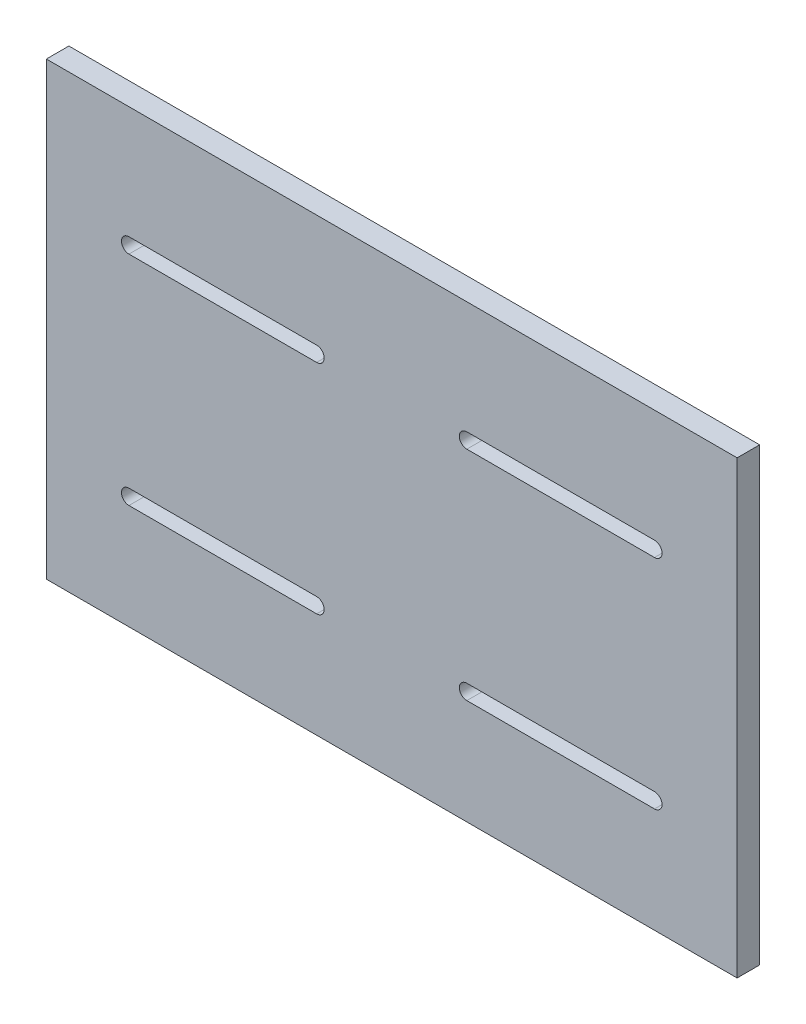
ISO-10303-21;
HEADER;
FILE_DESCRIPTION(('STEP AP214'),'2;1');
FILE_NAME('part.step','',(''),(''),'','','');
FILE_SCHEMA(('AUTOMOTIVE_DESIGN { 1 0 10303 214 1 1 1 1 }'));
ENDSEC;
DATA;
#1=APPLICATION_CONTEXT('core data for automotive mechanical design processes');
#2=APPLICATION_PROTOCOL_DEFINITION('international standard','automotive_design',2000,#1);
#3=PRODUCT_CONTEXT('',#1,'mechanical');
#4=PRODUCT('Part','Part','',(#3));
#5=PRODUCT_RELATED_PRODUCT_CATEGORY('part','',(#4));
#6=PRODUCT_DEFINITION_FORMATION('','',#4);
#7=PRODUCT_DEFINITION_CONTEXT('part definition',#1,'design');
#8=PRODUCT_DEFINITION('design','',#6,#7);
#9=PRODUCT_DEFINITION_SHAPE('','',#8);
#10=(LENGTH_UNIT() NAMED_UNIT(*) SI_UNIT(.MILLI.,.METRE.));
#11=(NAMED_UNIT(*) PLANE_ANGLE_UNIT() SI_UNIT($,.RADIAN.));
#12=(NAMED_UNIT(*) SI_UNIT($,.STERADIAN.) SOLID_ANGLE_UNIT());
#13=UNCERTAINTY_MEASURE_WITH_UNIT(LENGTH_MEASURE(1.E-05),#10,'distance_accuracy_value','');
#14=(GEOMETRIC_REPRESENTATION_CONTEXT(3) GLOBAL_UNCERTAINTY_ASSIGNED_CONTEXT((#13)) GLOBAL_UNIT_ASSIGNED_CONTEXT((#10,
#11,#12)) REPRESENTATION_CONTEXT('',''));
#15=CARTESIAN_POINT('',(0.,0.,0.));
#16=DIRECTION('',(0.,0.,1.));
#17=DIRECTION('',(1.,0.,0.));
#18=AXIS2_PLACEMENT_3D('',#15,#16,#17);
#19=CARTESIAN_POINT('',(46.,30.,3.));
#20=DIRECTION('',(-1.,0.,0.));
#21=DIRECTION('',(0.,-1.,0.));
#22=AXIS2_PLACEMENT_3D('',#19,#20,#21);
#23=PLANE('',#22);
#24=DIRECTION('',(0.,1.,0.));
#25=VECTOR('',#24,1.);
#26=CARTESIAN_POINT('',(46.,30.,0.));
#27=LINE('',#26,#25);
#28=CARTESIAN_POINT('',(46.,-30.,0.));
#29=VERTEX_POINT('',#28);
#30=CARTESIAN_POINT('',(46.,30.,0.));
#31=VERTEX_POINT('',#30);
#32=EDGE_CURVE('E296',#29,#31,#27,.T.);
#33=ORIENTED_EDGE('',*,*,#32,.T.);
#34=DIRECTION('',(0.,0.,-1.));
#35=VECTOR('',#34,1.);
#36=CARTESIAN_POINT('',(46.,30.,3.));
#37=LINE('',#36,#35);
#38=CARTESIAN_POINT('',(46.,30.,3.));
#39=VERTEX_POINT('',#38);
#40=EDGE_CURVE('E11',#39,#31,#37,.T.);
#41=ORIENTED_EDGE('',*,*,#40,.F.);
#42=DIRECTION('',(0.,1.,0.));
#43=VECTOR('',#42,1.);
#44=CARTESIAN_POINT('',(46.,30.,3.));
#45=LINE('',#44,#43);
#46=CARTESIAN_POINT('',(46.,-30.,3.));
#47=VERTEX_POINT('',#46);
#48=EDGE_CURVE('E303',#47,#39,#45,.T.);
#49=ORIENTED_EDGE('',*,*,#48,.F.);
#50=DIRECTION('',(0.,0.,-1.));
#51=VECTOR('',#50,1.);
#52=CARTESIAN_POINT('',(46.,-30.,3.));
#53=LINE('',#52,#51);
#54=EDGE_CURVE('E313',#47,#29,#53,.T.);
#55=ORIENTED_EDGE('',*,*,#54,.T.);
#56=EDGE_LOOP('',(#33,#41,#49,#55));
#57=FACE_BOUND('',#56,.T.);
#58=ADVANCED_FACE('F33',(#57),#23,.F.);
#59=CARTESIAN_POINT('',(-46.,30.,3.));
#60=DIRECTION('',(0.,-1.,0.));
#61=DIRECTION('',(0.,0.,-1.));
#62=AXIS2_PLACEMENT_3D('',#59,#60,#61);
#63=PLANE('',#62);
#64=DIRECTION('',(-1.,0.,0.));
#65=VECTOR('',#64,1.);
#66=CARTESIAN_POINT('',(-46.,30.,0.));
#67=LINE('',#66,#65);
#68=CARTESIAN_POINT('',(-46.,30.,0.));
#69=VERTEX_POINT('',#68);
#70=EDGE_CURVE('E316',#31,#69,#67,.T.);
#71=ORIENTED_EDGE('',*,*,#70,.T.);
#72=DIRECTION('',(0.,0.,-1.));
#73=VECTOR('',#72,1.);
#74=CARTESIAN_POINT('',(-46.,30.,3.));
#75=LINE('',#74,#73);
#76=CARTESIAN_POINT('',(-46.,30.,3.));
#77=VERTEX_POINT('',#76);
#78=EDGE_CURVE('E40',#77,#69,#75,.T.);
#79=ORIENTED_EDGE('',*,*,#78,.F.);
#80=DIRECTION('',(-1.,0.,0.));
#81=VECTOR('',#80,1.);
#82=CARTESIAN_POINT('',(-46.,30.,3.));
#83=LINE('',#82,#81);
#84=EDGE_CURVE('E306',#39,#77,#83,.T.);
#85=ORIENTED_EDGE('',*,*,#84,.F.);
#86=ORIENTED_EDGE('',*,*,#40,.T.);
#87=EDGE_LOOP('',(#71,#79,#85,#86));
#88=FACE_BOUND('',#87,.T.);
#89=ADVANCED_FACE('F345',(#88),#63,.F.);
#90=CARTESIAN_POINT('',(-46.,30.,3.));
#91=DIRECTION('',(1.,0.,0.));
#92=DIRECTION('',(0.,1.,0.));
#93=AXIS2_PLACEMENT_3D('',#90,#91,#92);
#94=PLANE('',#93);
#95=DIRECTION('',(0.,-1.,0.));
#96=VECTOR('',#95,1.);
#97=CARTESIAN_POINT('',(-46.,30.,0.));
#98=LINE('',#97,#96);
#99=CARTESIAN_POINT('',(-46.,-30.,0.));
#100=VERTEX_POINT('',#99);
#101=EDGE_CURVE('E318',#69,#100,#98,.T.);
#102=ORIENTED_EDGE('',*,*,#101,.T.);
#103=DIRECTION('',(0.,0.,-1.));
#104=VECTOR('',#103,1.);
#105=CARTESIAN_POINT('',(-46.,-30.,3.));
#106=LINE('',#105,#104);
#107=CARTESIAN_POINT('',(-46.,-30.,3.));
#108=VERTEX_POINT('',#107);
#109=EDGE_CURVE('E323',#108,#100,#106,.T.);
#110=ORIENTED_EDGE('',*,*,#109,.F.);
#111=DIRECTION('',(0.,-1.,0.));
#112=VECTOR('',#111,1.);
#113=CARTESIAN_POINT('',(-46.,30.,3.));
#114=LINE('',#113,#112);
#115=EDGE_CURVE('E309',#77,#108,#114,.T.);
#116=ORIENTED_EDGE('',*,*,#115,.F.);
#117=ORIENTED_EDGE('',*,*,#78,.T.);
#118=EDGE_LOOP('',(#102,#110,#116,#117));
#119=FACE_BOUND('',#118,.T.);
#120=ADVANCED_FACE('F330',(#119),#94,.F.);
#121=CARTESIAN_POINT('',(-46.,-30.,3.));
#122=DIRECTION('',(0.,1.,0.));
#123=DIRECTION('',(0.,0.,1.));
#124=AXIS2_PLACEMENT_3D('',#121,#122,#123);
#125=PLANE('',#124);
#126=DIRECTION('',(1.,0.,0.));
#127=VECTOR('',#126,1.);
#128=CARTESIAN_POINT('',(-46.,-30.,0.));
#129=LINE('',#128,#127);
#130=EDGE_CURVE('E307',#100,#29,#129,.T.);
#131=ORIENTED_EDGE('',*,*,#130,.T.);
#132=ORIENTED_EDGE('',*,*,#54,.F.);
#133=DIRECTION('',(1.,0.,0.));
#134=VECTOR('',#133,1.);
#135=CARTESIAN_POINT('',(-46.,-30.,3.));
#136=LINE('',#135,#134);
#137=EDGE_CURVE('E311',#108,#47,#136,.T.);
#138=ORIENTED_EDGE('',*,*,#137,.F.);
#139=ORIENTED_EDGE('',*,*,#109,.T.);
#140=EDGE_LOOP('',(#131,#132,#138,#139));
#141=FACE_BOUND('',#140,.T.);
#142=ADVANCED_FACE('F338',(#141),#125,.F.);
#143=CARTESIAN_POINT('',(0.,0.,3.));
#144=DIRECTION('',(0.,0.,1.));
#145=DIRECTION('',(1.,0.,0.));
#146=AXIS2_PLACEMENT_3D('',#143,#144,#145);
#147=PLANE('',#146);
#148=CARTESIAN_POINT('',(-35.,-15.,3.));
#149=DIRECTION('',(0.,0.,1.));
#150=DIRECTION('',(1.,0.,0.));
#151=AXIS2_PLACEMENT_3D('',#148,#149,#150);
#152=CIRCLE('',#151,1.00000000000001);
#153=CARTESIAN_POINT('',(-35.,-14.,3.));
#154=VERTEX_POINT('',#153);
#155=CARTESIAN_POINT('',(-35.,-16.,3.));
#156=VERTEX_POINT('',#155);
#157=EDGE_CURVE('E47',#154,#156,#152,.T.);
#158=ORIENTED_EDGE('',*,*,#157,.F.);
#159=DIRECTION('',(-1.,0.,0.));
#160=VECTOR('',#159,1.);
#161=CARTESIAN_POINT('',(-35.,-14.,3.));
#162=LINE('',#161,#160);
#163=CARTESIAN_POINT('',(-9.99999999999999,-14.,3.));
#164=VERTEX_POINT('',#163);
#165=EDGE_CURVE('E190',#164,#154,#162,.T.);
#166=ORIENTED_EDGE('',*,*,#165,.F.);
#167=CARTESIAN_POINT('',(-9.99999999999999,-15.,3.));
#168=DIRECTION('',(0.,0.,1.));
#169=DIRECTION('',(1.,0.,0.));
#170=AXIS2_PLACEMENT_3D('',#167,#168,#169);
#171=CIRCLE('',#170,1.00000000000001);
#172=CARTESIAN_POINT('',(-9.99999999999999,-16.,3.));
#173=VERTEX_POINT('',#172);
#174=EDGE_CURVE('E193',#173,#164,#171,.T.);
#175=ORIENTED_EDGE('',*,*,#174,.F.);
#176=DIRECTION('',(1.,0.,0.));
#177=VECTOR('',#176,1.);
#178=CARTESIAN_POINT('',(-35.,-16.,3.));
#179=LINE('',#178,#177);
#180=EDGE_CURVE('E199',#156,#173,#179,.T.);
#181=ORIENTED_EDGE('',*,*,#180,.F.);
#182=EDGE_LOOP('',(#158,#166,#175,#181));
#183=FACE_BOUND('',#182,.T.);
#184=CARTESIAN_POINT('',(35.,14.,3.));
#185=DIRECTION('',(0.,0.,1.));
#186=DIRECTION('',(1.,0.,0.));
#187=AXIS2_PLACEMENT_3D('',#184,#185,#186);
#188=CIRCLE('',#187,0.999999999999999);
#189=CARTESIAN_POINT('',(35.,13.,3.));
#190=VERTEX_POINT('',#189);
#191=CARTESIAN_POINT('',(35.,15.,3.));
#192=VERTEX_POINT('',#191);
#193=EDGE_CURVE('E55',#190,#192,#188,.T.);
#194=ORIENTED_EDGE('',*,*,#193,.F.);
#195=DIRECTION('',(1.,0.,0.));
#196=VECTOR('',#195,1.);
#197=CARTESIAN_POINT('',(35.,13.,3.));
#198=LINE('',#197,#196);
#199=CARTESIAN_POINT('',(10.,13.,3.));
#200=VERTEX_POINT('',#199);
#201=EDGE_CURVE('E214',#200,#190,#198,.T.);
#202=ORIENTED_EDGE('',*,*,#201,.F.);
#203=CARTESIAN_POINT('',(10.,14.,3.));
#204=DIRECTION('',(0.,0.,1.));
#205=DIRECTION('',(1.,0.,0.));
#206=AXIS2_PLACEMENT_3D('',#203,#204,#205);
#207=CIRCLE('',#206,0.999999999999999);
#208=CARTESIAN_POINT('',(10.,15.,3.));
#209=VERTEX_POINT('',#208);
#210=EDGE_CURVE('E229',#209,#200,#207,.T.);
#211=ORIENTED_EDGE('',*,*,#210,.F.);
#212=DIRECTION('',(-1.,0.,0.));
#213=VECTOR('',#212,1.);
#214=CARTESIAN_POINT('',(35.,15.,3.));
#215=LINE('',#214,#213);
#216=EDGE_CURVE('E225',#192,#209,#215,.T.);
#217=ORIENTED_EDGE('',*,*,#216,.F.);
#218=EDGE_LOOP('',(#194,#202,#211,#217));
#219=FACE_BOUND('',#218,.T.);
#220=CARTESIAN_POINT('',(35.,-15.,3.));
#221=DIRECTION('',(0.,0.,1.));
#222=DIRECTION('',(1.,0.,0.));
#223=AXIS2_PLACEMENT_3D('',#220,#221,#222);
#224=CIRCLE('',#223,1.);
#225=CARTESIAN_POINT('',(35.,-16.,3.));
#226=VERTEX_POINT('',#225);
#227=CARTESIAN_POINT('',(35.,-14.,3.));
#228=VERTEX_POINT('',#227);
#229=EDGE_CURVE('E254',#226,#228,#224,.T.);
#230=ORIENTED_EDGE('',*,*,#229,.F.);
#231=DIRECTION('',(1.,0.,0.));
#232=VECTOR('',#231,1.);
#233=CARTESIAN_POINT('',(35.,-16.,3.));
#234=LINE('',#233,#232);
#235=CARTESIAN_POINT('',(10.,-16.,3.));
#236=VERTEX_POINT('',#235);
#237=EDGE_CURVE('E244',#236,#226,#234,.T.);
#238=ORIENTED_EDGE('',*,*,#237,.F.);
#239=CARTESIAN_POINT('',(10.,-15.,3.));
#240=DIRECTION('',(0.,0.,1.));
#241=DIRECTION('',(1.,0.,0.));
#242=AXIS2_PLACEMENT_3D('',#239,#240,#241);
#243=CIRCLE('',#242,1.);
#244=CARTESIAN_POINT('',(10.,-14.,3.));
#245=VERTEX_POINT('',#244);
#246=EDGE_CURVE('E259',#245,#236,#243,.T.);
#247=ORIENTED_EDGE('',*,*,#246,.F.);
#248=DIRECTION('',(-1.,0.,0.));
#249=VECTOR('',#248,1.);
#250=CARTESIAN_POINT('',(35.,-14.,3.));
#251=LINE('',#250,#249);
#252=EDGE_CURVE('E256',#228,#245,#251,.T.);
#253=ORIENTED_EDGE('',*,*,#252,.F.);
#254=EDGE_LOOP('',(#230,#238,#247,#253));
#255=FACE_BOUND('',#254,.T.);
#256=CARTESIAN_POINT('',(-35.,14.,3.));
#257=DIRECTION('',(0.,0.,1.));
#258=DIRECTION('',(1.,0.,0.));
#259=AXIS2_PLACEMENT_3D('',#256,#257,#258);
#260=CIRCLE('',#259,1.);
#261=CARTESIAN_POINT('',(-35.,15.,3.));
#262=VERTEX_POINT('',#261);
#263=CARTESIAN_POINT('',(-35.,13.,3.));
#264=VERTEX_POINT('',#263);
#265=EDGE_CURVE('E206',#262,#264,#260,.T.);
#266=ORIENTED_EDGE('',*,*,#265,.F.);
#267=DIRECTION('',(-1.,0.,0.));
#268=VECTOR('',#267,1.);
#269=CARTESIAN_POINT('',(-35.,15.,3.));
#270=LINE('',#269,#268);
#271=CARTESIAN_POINT('',(-10.,15.,3.));
#272=VERTEX_POINT('',#271);
#273=EDGE_CURVE('E275',#272,#262,#270,.T.);
#274=ORIENTED_EDGE('',*,*,#273,.F.);
#275=CARTESIAN_POINT('',(-10.,14.,3.));
#276=DIRECTION('',(0.,0.,1.));
#277=DIRECTION('',(1.,0.,0.));
#278=AXIS2_PLACEMENT_3D('',#275,#276,#277);
#279=CIRCLE('',#278,1.);
#280=CARTESIAN_POINT('',(-10.,13.,3.));
#281=VERTEX_POINT('',#280);
#282=EDGE_CURVE('E289',#281,#272,#279,.T.);
#283=ORIENTED_EDGE('',*,*,#282,.F.);
#284=DIRECTION('',(1.,0.,0.));
#285=VECTOR('',#284,1.);
#286=CARTESIAN_POINT('',(-35.,13.,3.));
#287=LINE('',#286,#285);
#288=EDGE_CURVE('E286',#264,#281,#287,.T.);
#289=ORIENTED_EDGE('',*,*,#288,.F.);
#290=EDGE_LOOP('',(#266,#274,#283,#289));
#291=FACE_BOUND('',#290,.T.);
#292=ORIENTED_EDGE('',*,*,#48,.T.);
#293=ORIENTED_EDGE('',*,*,#84,.T.);
#294=ORIENTED_EDGE('',*,*,#115,.T.);
#295=ORIENTED_EDGE('',*,*,#137,.T.);
#296=EDGE_LOOP('',(#292,#293,#294,#295));
#297=FACE_BOUND('',#296,.T.);
#298=ADVANCED_FACE('F344',(#183,#219,#255,#291,#297),#147,.T.);
#299=CARTESIAN_POINT('',(0.,0.,0.));
#300=DIRECTION('',(0.,0.,1.));
#301=DIRECTION('',(1.,0.,0.));
#302=AXIS2_PLACEMENT_3D('',#299,#300,#301);
#303=PLANE('',#302);
#304=DIRECTION('',(-1.,0.,0.));
#305=VECTOR('',#304,1.);
#306=CARTESIAN_POINT('',(-35.,-14.,0.));
#307=LINE('',#306,#305);
#308=CARTESIAN_POINT('',(-9.99999999999999,-14.,0.));
#309=VERTEX_POINT('',#308);
#310=CARTESIAN_POINT('',(-35.,-14.,0.));
#311=VERTEX_POINT('',#310);
#312=EDGE_CURVE('E177',#309,#311,#307,.T.);
#313=ORIENTED_EDGE('',*,*,#312,.T.);
#314=CARTESIAN_POINT('',(-35.,-15.,0.));
#315=DIRECTION('',(0.,0.,1.));
#316=DIRECTION('',(1.,0.,0.));
#317=AXIS2_PLACEMENT_3D('',#314,#315,#316);
#318=CIRCLE('',#317,1.00000000000001);
#319=CARTESIAN_POINT('',(-35.,-16.,0.));
#320=VERTEX_POINT('',#319);
#321=EDGE_CURVE('E171',#311,#320,#318,.T.);
#322=ORIENTED_EDGE('',*,*,#321,.T.);
#323=DIRECTION('',(1.,0.,0.));
#324=VECTOR('',#323,1.);
#325=CARTESIAN_POINT('',(-35.,-16.,0.));
#326=LINE('',#325,#324);
#327=CARTESIAN_POINT('',(-9.99999999999999,-16.,0.));
#328=VERTEX_POINT('',#327);
#329=EDGE_CURVE('E181',#320,#328,#326,.T.);
#330=ORIENTED_EDGE('',*,*,#329,.T.);
#331=CARTESIAN_POINT('',(-9.99999999999999,-15.,0.));
#332=DIRECTION('',(0.,0.,1.));
#333=DIRECTION('',(1.,0.,0.));
#334=AXIS2_PLACEMENT_3D('',#331,#332,#333);
#335=CIRCLE('',#334,1.00000000000001);
#336=EDGE_CURVE('E185',#328,#309,#335,.T.);
#337=ORIENTED_EDGE('',*,*,#336,.T.);
#338=EDGE_LOOP('',(#313,#322,#330,#337));
#339=FACE_BOUND('',#338,.T.);
#340=DIRECTION('',(1.,0.,0.));
#341=VECTOR('',#340,1.);
#342=CARTESIAN_POINT('',(35.,13.,0.));
#343=LINE('',#342,#341);
#344=CARTESIAN_POINT('',(10.,13.,0.));
#345=VERTEX_POINT('',#344);
#346=CARTESIAN_POINT('',(35.,13.,0.));
#347=VERTEX_POINT('',#346);
#348=EDGE_CURVE('E220',#345,#347,#343,.T.);
#349=ORIENTED_EDGE('',*,*,#348,.T.);
#350=CARTESIAN_POINT('',(35.,14.,0.));
#351=DIRECTION('',(0.,0.,1.));
#352=DIRECTION('',(1.,0.,0.));
#353=AXIS2_PLACEMENT_3D('',#350,#351,#352);
#354=CIRCLE('',#353,0.999999999999999);
#355=CARTESIAN_POINT('',(35.,15.,0.));
#356=VERTEX_POINT('',#355);
#357=EDGE_CURVE('E210',#347,#356,#354,.T.);
#358=ORIENTED_EDGE('',*,*,#357,.T.);
#359=DIRECTION('',(-1.,0.,0.));
#360=VECTOR('',#359,1.);
#361=CARTESIAN_POINT('',(35.,15.,0.));
#362=LINE('',#361,#360);
#363=CARTESIAN_POINT('',(10.,15.,0.));
#364=VERTEX_POINT('',#363);
#365=EDGE_CURVE('E213',#356,#364,#362,.T.);
#366=ORIENTED_EDGE('',*,*,#365,.T.);
#367=CARTESIAN_POINT('',(10.,14.,0.));
#368=DIRECTION('',(0.,0.,1.));
#369=DIRECTION('',(1.,0.,0.));
#370=AXIS2_PLACEMENT_3D('',#367,#368,#369);
#371=CIRCLE('',#370,0.999999999999999);
#372=EDGE_CURVE('E217',#364,#345,#371,.T.);
#373=ORIENTED_EDGE('',*,*,#372,.T.);
#374=EDGE_LOOP('',(#349,#358,#366,#373));
#375=FACE_BOUND('',#374,.T.);
#376=DIRECTION('',(1.,0.,0.));
#377=VECTOR('',#376,1.);
#378=CARTESIAN_POINT('',(35.,-16.,0.));
#379=LINE('',#378,#377);
#380=CARTESIAN_POINT('',(10.,-16.,0.));
#381=VERTEX_POINT('',#380);
#382=CARTESIAN_POINT('',(35.,-16.,0.));
#383=VERTEX_POINT('',#382);
#384=EDGE_CURVE('E250',#381,#383,#379,.T.);
#385=ORIENTED_EDGE('',*,*,#384,.T.);
#386=CARTESIAN_POINT('',(35.,-15.,0.));
#387=DIRECTION('',(0.,0.,1.));
#388=DIRECTION('',(1.,0.,0.));
#389=AXIS2_PLACEMENT_3D('',#386,#387,#388);
#390=CIRCLE('',#389,1.);
#391=CARTESIAN_POINT('',(35.,-14.,0.));
#392=VERTEX_POINT('',#391);
#393=EDGE_CURVE('E240',#383,#392,#390,.T.);
#394=ORIENTED_EDGE('',*,*,#393,.T.);
#395=DIRECTION('',(-1.,0.,0.));
#396=VECTOR('',#395,1.);
#397=CARTESIAN_POINT('',(35.,-14.,0.));
#398=LINE('',#397,#396);
#399=CARTESIAN_POINT('',(10.,-14.,0.));
#400=VERTEX_POINT('',#399);
#401=EDGE_CURVE('E243',#392,#400,#398,.T.);
#402=ORIENTED_EDGE('',*,*,#401,.T.);
#403=CARTESIAN_POINT('',(10.,-15.,0.));
#404=DIRECTION('',(0.,0.,1.));
#405=DIRECTION('',(1.,0.,0.));
#406=AXIS2_PLACEMENT_3D('',#403,#404,#405);
#407=CIRCLE('',#406,1.);
#408=EDGE_CURVE('E247',#400,#381,#407,.T.);
#409=ORIENTED_EDGE('',*,*,#408,.T.);
#410=EDGE_LOOP('',(#385,#394,#402,#409));
#411=FACE_BOUND('',#410,.T.);
#412=DIRECTION('',(-1.,0.,0.));
#413=VECTOR('',#412,1.);
#414=CARTESIAN_POINT('',(-35.,15.,0.));
#415=LINE('',#414,#413);
#416=CARTESIAN_POINT('',(-10.,15.,0.));
#417=VERTEX_POINT('',#416);
#418=CARTESIAN_POINT('',(-35.,15.,0.));
#419=VERTEX_POINT('',#418);
#420=EDGE_CURVE('E281',#417,#419,#415,.T.);
#421=ORIENTED_EDGE('',*,*,#420,.T.);
#422=CARTESIAN_POINT('',(-35.,14.,0.));
#423=DIRECTION('',(0.,0.,1.));
#424=DIRECTION('',(1.,0.,0.));
#425=AXIS2_PLACEMENT_3D('',#422,#423,#424);
#426=CIRCLE('',#425,1.);
#427=CARTESIAN_POINT('',(-35.,13.,0.));
#428=VERTEX_POINT('',#427);
#429=EDGE_CURVE('E271',#419,#428,#426,.T.);
#430=ORIENTED_EDGE('',*,*,#429,.T.);
#431=DIRECTION('',(1.,0.,0.));
#432=VECTOR('',#431,1.);
#433=CARTESIAN_POINT('',(-35.,13.,0.));
#434=LINE('',#433,#432);
#435=CARTESIAN_POINT('',(-10.,13.,0.));
#436=VERTEX_POINT('',#435);
#437=EDGE_CURVE('E274',#428,#436,#434,.T.);
#438=ORIENTED_EDGE('',*,*,#437,.T.);
#439=CARTESIAN_POINT('',(-10.,14.,0.));
#440=DIRECTION('',(0.,0.,1.));
#441=DIRECTION('',(1.,0.,0.));
#442=AXIS2_PLACEMENT_3D('',#439,#440,#441);
#443=CIRCLE('',#442,1.);
#444=EDGE_CURVE('E278',#436,#417,#443,.T.);
#445=ORIENTED_EDGE('',*,*,#444,.T.);
#446=EDGE_LOOP('',(#421,#430,#438,#445));
#447=FACE_BOUND('',#446,.T.);
#448=ORIENTED_EDGE('',*,*,#32,.F.);
#449=ORIENTED_EDGE('',*,*,#130,.F.);
#450=ORIENTED_EDGE('',*,*,#101,.F.);
#451=ORIENTED_EDGE('',*,*,#70,.F.);
#452=EDGE_LOOP('',(#448,#449,#450,#451));
#453=FACE_BOUND('',#452,.T.);
#454=ADVANCED_FACE('F187',(#339,#375,#411,#447,#453),#303,.F.);
#455=CARTESIAN_POINT('',(-35.,14.,0.));
#456=DIRECTION('',(0.,0.,1.));
#457=DIRECTION('',(1.,0.,0.));
#458=AXIS2_PLACEMENT_3D('',#455,#456,#457);
#459=CYLINDRICAL_SURFACE('',#458,1.);
#460=ORIENTED_EDGE('',*,*,#265,.T.);
#461=DIRECTION('',(0.,0.,1.));
#462=VECTOR('',#461,1.);
#463=CARTESIAN_POINT('',(-35.,13.,0.));
#464=LINE('',#463,#462);
#465=EDGE_CURVE('E284',#428,#264,#464,.T.);
#466=ORIENTED_EDGE('',*,*,#465,.F.);
#467=ORIENTED_EDGE('',*,*,#429,.F.);
#468=DIRECTION('',(0.,0.,1.));
#469=VECTOR('',#468,1.);
#470=CARTESIAN_POINT('',(-35.,15.,0.));
#471=LINE('',#470,#469);
#472=EDGE_CURVE('E294',#419,#262,#471,.T.);
#473=ORIENTED_EDGE('',*,*,#472,.T.);
#474=EDGE_LOOP('',(#460,#466,#467,#473));
#475=FACE_BOUND('',#474,.T.);
#476=ADVANCED_FACE('F357',(#475),#459,.F.);
#477=CARTESIAN_POINT('',(-35.,15.,0.));
#478=DIRECTION('',(0.,1.,0.));
#479=DIRECTION('',(0.,0.,1.));
#480=AXIS2_PLACEMENT_3D('',#477,#478,#479);
#481=PLANE('',#480);
#482=ORIENTED_EDGE('',*,*,#273,.T.);
#483=ORIENTED_EDGE('',*,*,#472,.F.);
#484=ORIENTED_EDGE('',*,*,#420,.F.);
#485=DIRECTION('',(0.,0.,1.));
#486=VECTOR('',#485,1.);
#487=CARTESIAN_POINT('',(-10.,15.,0.));
#488=LINE('',#487,#486);
#489=EDGE_CURVE('E297',#417,#272,#488,.T.);
#490=ORIENTED_EDGE('',*,*,#489,.T.);
#491=EDGE_LOOP('',(#482,#483,#484,#490));
#492=FACE_BOUND('',#491,.T.);
#493=ADVANCED_FACE('F363',(#492),#481,.F.);
#494=CARTESIAN_POINT('',(-10.,14.,0.));
#495=DIRECTION('',(0.,0.,1.));
#496=DIRECTION('',(1.,0.,0.));
#497=AXIS2_PLACEMENT_3D('',#494,#495,#496);
#498=CYLINDRICAL_SURFACE('',#497,1.);
#499=ORIENTED_EDGE('',*,*,#282,.T.);
#500=ORIENTED_EDGE('',*,*,#489,.F.);
#501=ORIENTED_EDGE('',*,*,#444,.F.);
#502=DIRECTION('',(0.,0.,1.));
#503=VECTOR('',#502,1.);
#504=CARTESIAN_POINT('',(-10.,13.,0.));
#505=LINE('',#504,#503);
#506=EDGE_CURVE('E299',#436,#281,#505,.T.);
#507=ORIENTED_EDGE('',*,*,#506,.T.);
#508=EDGE_LOOP('',(#499,#500,#501,#507));
#509=FACE_BOUND('',#508,.T.);
#510=ADVANCED_FACE('F369',(#509),#498,.F.);
#511=CARTESIAN_POINT('',(-35.,13.,0.));
#512=DIRECTION('',(0.,-1.,0.));
#513=DIRECTION('',(0.,0.,-1.));
#514=AXIS2_PLACEMENT_3D('',#511,#512,#513);
#515=PLANE('',#514);
#516=ORIENTED_EDGE('',*,*,#288,.T.);
#517=ORIENTED_EDGE('',*,*,#506,.F.);
#518=ORIENTED_EDGE('',*,*,#437,.F.);
#519=ORIENTED_EDGE('',*,*,#465,.T.);
#520=EDGE_LOOP('',(#516,#517,#518,#519));
#521=FACE_BOUND('',#520,.T.);
#522=ADVANCED_FACE('F365',(#521),#515,.F.);
#523=CARTESIAN_POINT('',(35.,-15.,0.));
#524=DIRECTION('',(0.,0.,1.));
#525=DIRECTION('',(1.,0.,0.));
#526=AXIS2_PLACEMENT_3D('',#523,#524,#525);
#527=CYLINDRICAL_SURFACE('',#526,1.);
#528=ORIENTED_EDGE('',*,*,#229,.T.);
#529=DIRECTION('',(0.,0.,1.));
#530=VECTOR('',#529,1.);
#531=CARTESIAN_POINT('',(35.,-14.,0.));
#532=LINE('',#531,#530);
#533=EDGE_CURVE('E253',#392,#228,#532,.T.);
#534=ORIENTED_EDGE('',*,*,#533,.F.);
#535=ORIENTED_EDGE('',*,*,#393,.F.);
#536=DIRECTION('',(0.,0.,1.));
#537=VECTOR('',#536,1.);
#538=CARTESIAN_POINT('',(35.,-16.,0.));
#539=LINE('',#538,#537);
#540=EDGE_CURVE('E226',#383,#226,#539,.T.);
#541=ORIENTED_EDGE('',*,*,#540,.T.);
#542=EDGE_LOOP('',(#528,#534,#535,#541));
#543=FACE_BOUND('',#542,.T.);
#544=ADVANCED_FACE('F368',(#543),#527,.F.);
#545=CARTESIAN_POINT('',(35.,-16.,0.));
#546=DIRECTION('',(0.,-1.,0.));
#547=DIRECTION('',(0.,0.,-1.));
#548=AXIS2_PLACEMENT_3D('',#545,#546,#547);
#549=PLANE('',#548);
#550=ORIENTED_EDGE('',*,*,#237,.T.);
#551=ORIENTED_EDGE('',*,*,#540,.F.);
#552=ORIENTED_EDGE('',*,*,#384,.F.);
#553=DIRECTION('',(0.,0.,1.));
#554=VECTOR('',#553,1.);
#555=CARTESIAN_POINT('',(10.,-16.,0.));
#556=LINE('',#555,#554);
#557=EDGE_CURVE('E265',#381,#236,#556,.T.);
#558=ORIENTED_EDGE('',*,*,#557,.T.);
#559=EDGE_LOOP('',(#550,#551,#552,#558));
#560=FACE_BOUND('',#559,.T.);
#561=ADVANCED_FACE('F379',(#560),#549,.F.);
#562=CARTESIAN_POINT('',(10.,-15.,0.));
#563=DIRECTION('',(0.,0.,1.));
#564=DIRECTION('',(1.,0.,0.));
#565=AXIS2_PLACEMENT_3D('',#562,#563,#564);
#566=CYLINDRICAL_SURFACE('',#565,1.);
#567=ORIENTED_EDGE('',*,*,#246,.T.);
#568=ORIENTED_EDGE('',*,*,#557,.F.);
#569=ORIENTED_EDGE('',*,*,#408,.F.);
#570=DIRECTION('',(0.,0.,1.));
#571=VECTOR('',#570,1.);
#572=CARTESIAN_POINT('',(10.,-14.,0.));
#573=LINE('',#572,#571);
#574=EDGE_CURVE('E267',#400,#245,#573,.T.);
#575=ORIENTED_EDGE('',*,*,#574,.T.);
#576=EDGE_LOOP('',(#567,#568,#569,#575));
#577=FACE_BOUND('',#576,.T.);
#578=ADVANCED_FACE('F385',(#577),#566,.F.);
#579=CARTESIAN_POINT('',(35.,-14.,0.));
#580=DIRECTION('',(0.,1.,0.));
#581=DIRECTION('',(-1.,0.,0.));
#582=AXIS2_PLACEMENT_3D('',#579,#580,#581);
#583=PLANE('',#582);
#584=ORIENTED_EDGE('',*,*,#252,.T.);
#585=ORIENTED_EDGE('',*,*,#574,.F.);
#586=ORIENTED_EDGE('',*,*,#401,.F.);
#587=ORIENTED_EDGE('',*,*,#533,.T.);
#588=EDGE_LOOP('',(#584,#585,#586,#587));
#589=FACE_BOUND('',#588,.T.);
#590=ADVANCED_FACE('F381',(#589),#583,.F.);
#591=CARTESIAN_POINT('',(35.,14.,0.));
#592=DIRECTION('',(0.,0.,1.));
#593=DIRECTION('',(1.,0.,0.));
#594=AXIS2_PLACEMENT_3D('',#591,#592,#593);
#595=CYLINDRICAL_SURFACE('',#594,0.999999999999999);
#596=ORIENTED_EDGE('',*,*,#193,.T.);
#597=DIRECTION('',(0.,0.,1.));
#598=VECTOR('',#597,1.);
#599=CARTESIAN_POINT('',(35.,15.,0.));
#600=LINE('',#599,#598);
#601=EDGE_CURVE('E223',#356,#192,#600,.T.);
#602=ORIENTED_EDGE('',*,*,#601,.F.);
#603=ORIENTED_EDGE('',*,*,#357,.F.);
#604=DIRECTION('',(0.,0.,1.));
#605=VECTOR('',#604,1.);
#606=CARTESIAN_POINT('',(35.,13.,0.));
#607=LINE('',#606,#605);
#608=EDGE_CURVE('E200',#347,#190,#607,.T.);
#609=ORIENTED_EDGE('',*,*,#608,.T.);
#610=EDGE_LOOP('',(#596,#602,#603,#609));
#611=FACE_BOUND('',#610,.T.);
#612=ADVANCED_FACE('F384',(#611),#595,.F.);
#613=CARTESIAN_POINT('',(35.,13.,0.));
#614=DIRECTION('',(0.,-1.,0.));
#615=DIRECTION('',(1.,0.,0.));
#616=AXIS2_PLACEMENT_3D('',#613,#614,#615);
#617=PLANE('',#616);
#618=ORIENTED_EDGE('',*,*,#201,.T.);
#619=ORIENTED_EDGE('',*,*,#608,.F.);
#620=ORIENTED_EDGE('',*,*,#348,.F.);
#621=DIRECTION('',(0.,0.,1.));
#622=VECTOR('',#621,1.);
#623=CARTESIAN_POINT('',(10.,13.,0.));
#624=LINE('',#623,#622);
#625=EDGE_CURVE('E235',#345,#200,#624,.T.);
#626=ORIENTED_EDGE('',*,*,#625,.T.);
#627=EDGE_LOOP('',(#618,#619,#620,#626));
#628=FACE_BOUND('',#627,.T.);
#629=ADVANCED_FACE('F395',(#628),#617,.F.);
#630=CARTESIAN_POINT('',(10.,14.,0.));
#631=DIRECTION('',(0.,0.,1.));
#632=DIRECTION('',(1.,0.,0.));
#633=AXIS2_PLACEMENT_3D('',#630,#631,#632);
#634=CYLINDRICAL_SURFACE('',#633,0.999999999999999);
#635=ORIENTED_EDGE('',*,*,#210,.T.);
#636=ORIENTED_EDGE('',*,*,#625,.F.);
#637=ORIENTED_EDGE('',*,*,#372,.F.);
#638=DIRECTION('',(0.,0.,1.));
#639=VECTOR('',#638,1.);
#640=CARTESIAN_POINT('',(10.,15.,0.));
#641=LINE('',#640,#639);
#642=EDGE_CURVE('E237',#364,#209,#641,.T.);
#643=ORIENTED_EDGE('',*,*,#642,.T.);
#644=EDGE_LOOP('',(#635,#636,#637,#643));
#645=FACE_BOUND('',#644,.T.);
#646=ADVANCED_FACE('F399',(#645),#634,.F.);
#647=CARTESIAN_POINT('',(35.,15.,0.));
#648=DIRECTION('',(0.,1.,0.));
#649=DIRECTION('',(-1.,0.,0.));
#650=AXIS2_PLACEMENT_3D('',#647,#648,#649);
#651=PLANE('',#650);
#652=ORIENTED_EDGE('',*,*,#216,.T.);
#653=ORIENTED_EDGE('',*,*,#642,.F.);
#654=ORIENTED_EDGE('',*,*,#365,.F.);
#655=ORIENTED_EDGE('',*,*,#601,.T.);
#656=EDGE_LOOP('',(#652,#653,#654,#655));
#657=FACE_BOUND('',#656,.T.);
#658=ADVANCED_FACE('F396',(#657),#651,.F.);
#659=CARTESIAN_POINT('',(-35.,-15.,0.));
#660=DIRECTION('',(0.,0.,1.));
#661=DIRECTION('',(1.,0.,0.));
#662=AXIS2_PLACEMENT_3D('',#659,#660,#661);
#663=CYLINDRICAL_SURFACE('',#662,1.00000000000001);
#664=ORIENTED_EDGE('',*,*,#157,.T.);
#665=DIRECTION('',(0.,0.,1.));
#666=VECTOR('',#665,1.);
#667=CARTESIAN_POINT('',(-35.,-16.,0.));
#668=LINE('',#667,#666);
#669=EDGE_CURVE('E167',#320,#156,#668,.T.);
#670=ORIENTED_EDGE('',*,*,#669,.F.);
#671=ORIENTED_EDGE('',*,*,#321,.F.);
#672=DIRECTION('',(0.,0.,1.));
#673=VECTOR('',#672,1.);
#674=CARTESIAN_POINT('',(-35.,-14.,0.));
#675=LINE('',#674,#673);
#676=EDGE_CURVE('E204',#311,#154,#675,.T.);
#677=ORIENTED_EDGE('',*,*,#676,.T.);
#678=EDGE_LOOP('',(#664,#670,#671,#677));
#679=FACE_BOUND('',#678,.T.);
#680=ADVANCED_FACE('F169',(#679),#663,.F.);
#681=CARTESIAN_POINT('',(-35.,-14.,0.));
#682=DIRECTION('',(0.,1.,0.));
#683=DIRECTION('',(0.,0.,1.));
#684=AXIS2_PLACEMENT_3D('',#681,#682,#683);
#685=PLANE('',#684);
#686=ORIENTED_EDGE('',*,*,#165,.T.);
#687=ORIENTED_EDGE('',*,*,#676,.F.);
#688=ORIENTED_EDGE('',*,*,#312,.F.);
#689=DIRECTION('',(0.,0.,1.));
#690=VECTOR('',#689,1.);
#691=CARTESIAN_POINT('',(-9.99999999999999,-14.,0.));
#692=LINE('',#691,#690);
#693=EDGE_CURVE('E207',#309,#164,#692,.T.);
#694=ORIENTED_EDGE('',*,*,#693,.T.);
#695=EDGE_LOOP('',(#686,#687,#688,#694));
#696=FACE_BOUND('',#695,.T.);
#697=ADVANCED_FACE('F409',(#696),#685,.F.);
#698=CARTESIAN_POINT('',(-9.99999999999999,-15.,0.));
#699=DIRECTION('',(0.,0.,1.));
#700=DIRECTION('',(1.,0.,0.));
#701=AXIS2_PLACEMENT_3D('',#698,#699,#700);
#702=CYLINDRICAL_SURFACE('',#701,1.00000000000001);
#703=ORIENTED_EDGE('',*,*,#174,.T.);
#704=ORIENTED_EDGE('',*,*,#693,.F.);
#705=ORIENTED_EDGE('',*,*,#336,.F.);
#706=DIRECTION('',(0.,0.,1.));
#707=VECTOR('',#706,1.);
#708=CARTESIAN_POINT('',(-9.99999999999999,-16.,0.));
#709=LINE('',#708,#707);
#710=EDGE_CURVE('E176',#328,#173,#709,.T.);
#711=ORIENTED_EDGE('',*,*,#710,.T.);
#712=EDGE_LOOP('',(#703,#704,#705,#711));
#713=FACE_BOUND('',#712,.T.);
#714=ADVANCED_FACE('F412',(#713),#702,.F.);
#715=CARTESIAN_POINT('',(-35.,-16.,0.));
#716=DIRECTION('',(0.,-1.,0.));
#717=DIRECTION('',(1.,0.,0.));
#718=AXIS2_PLACEMENT_3D('',#715,#716,#717);
#719=PLANE('',#718);
#720=ORIENTED_EDGE('',*,*,#180,.T.);
#721=ORIENTED_EDGE('',*,*,#710,.F.);
#722=ORIENTED_EDGE('',*,*,#329,.F.);
#723=ORIENTED_EDGE('',*,*,#669,.T.);
#724=EDGE_LOOP('',(#720,#721,#722,#723));
#725=FACE_BOUND('',#724,.T.);
#726=ADVANCED_FACE('F182',(#725),#719,.F.);
#727=CLOSED_SHELL('',(#58,#89,#120,#142,#298,#454,#476,#493,#510,#522,#544,#561,#578,#590,#612,
#629,#646,#658,#680,#697,#714,#726));
#728=MANIFOLD_SOLID_BREP('B2',#727);
#729=ADVANCED_BREP_SHAPE_REPRESENTATION('',(#18,#728),#14);
#730=SHAPE_DEFINITION_REPRESENTATION(#9,#729);
ENDSEC;
END-ISO-10303-21;
